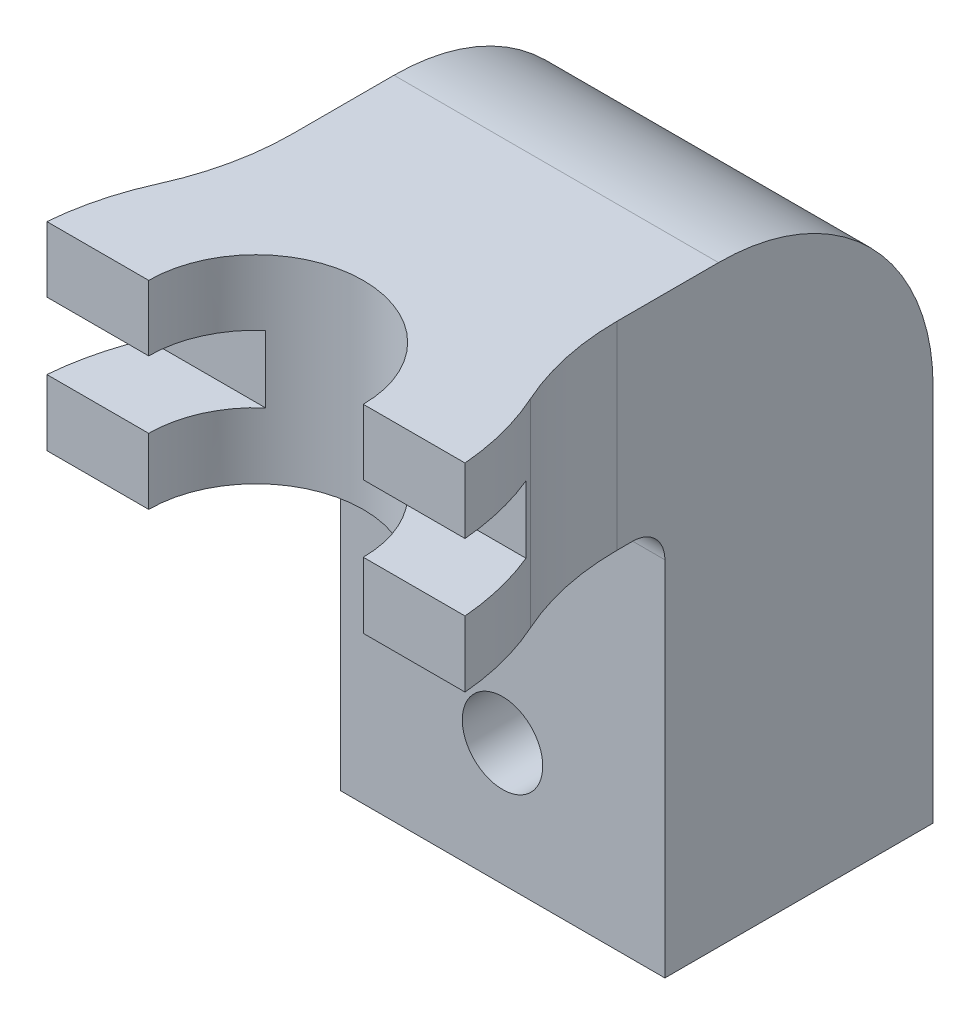
ISO-10303-21;
HEADER;
FILE_DESCRIPTION(('STEP AP214'),'2;1');
FILE_NAME('part.step','',(''),(''),'','','');
FILE_SCHEMA(('AUTOMOTIVE_DESIGN { 1 0 10303 214 1 1 1 1 }'));
ENDSEC;
DATA;
#1=APPLICATION_CONTEXT('core data for automotive mechanical design processes');
#2=APPLICATION_PROTOCOL_DEFINITION('international standard','automotive_design',2000,#1);
#3=PRODUCT_CONTEXT('',#1,'mechanical');
#4=PRODUCT('Part','Part','',(#3));
#5=PRODUCT_RELATED_PRODUCT_CATEGORY('part','',(#4));
#6=PRODUCT_DEFINITION_FORMATION('','',#4);
#7=PRODUCT_DEFINITION_CONTEXT('part definition',#1,'design');
#8=PRODUCT_DEFINITION('design','',#6,#7);
#9=PRODUCT_DEFINITION_SHAPE('','',#8);
#10=(LENGTH_UNIT() NAMED_UNIT(*) SI_UNIT(.MILLI.,.METRE.));
#11=(NAMED_UNIT(*) PLANE_ANGLE_UNIT() SI_UNIT($,.RADIAN.));
#12=(NAMED_UNIT(*) SI_UNIT($,.STERADIAN.) SOLID_ANGLE_UNIT());
#13=UNCERTAINTY_MEASURE_WITH_UNIT(LENGTH_MEASURE(1.E-05),#10,'distance_accuracy_value','');
#14=(GEOMETRIC_REPRESENTATION_CONTEXT(3) GLOBAL_UNCERTAINTY_ASSIGNED_CONTEXT((#13)) GLOBAL_UNIT_ASSIGNED_CONTEXT((#10,
#11,#12)) REPRESENTATION_CONTEXT('',''));
#15=CARTESIAN_POINT('',(0.,0.,0.));
#16=DIRECTION('',(0.,0.,1.));
#17=DIRECTION('',(1.,0.,0.));
#18=AXIS2_PLACEMENT_3D('',#15,#16,#17);
#19=CARTESIAN_POINT('',(6.05,11.05,19.1965710588231));
#20=DIRECTION('',(0.,0.,1.));
#21=DIRECTION('',(1.,0.,0.));
#22=AXIS2_PLACEMENT_3D('',#19,#20,#21);
#23=PLANE('',#22);
#24=DIRECTION('',(1.,0.,0.));
#25=VECTOR('',#24,1.);
#26=CARTESIAN_POINT('',(0.,8.61100015902011,19.1965710588231));
#27=LINE('',#26,#25);
#28=CARTESIAN_POINT('',(4.,8.61100015902011,19.1965710588231));
#29=VERTEX_POINT('',#28);
#30=CARTESIAN_POINT('',(7.79487874350443,8.61100015902011,19.1965710588231));
#31=VERTEX_POINT('',#30);
#32=EDGE_CURVE('E271',#29,#31,#27,.T.);
#33=ORIENTED_EDGE('',*,*,#32,.T.);
#34=DIRECTION('',(0.,1.,0.));
#35=VECTOR('',#34,1.);
#36=CARTESIAN_POINT('',(7.79487874350442,-1.39612428507829,19.1965710588231));
#37=LINE('',#36,#35);
#38=CARTESIAN_POINT('',(7.79487874350443,11.05,19.1965710588231));
#39=VERTEX_POINT('',#38);
#40=EDGE_CURVE('E444',#31,#39,#37,.T.);
#41=ORIENTED_EDGE('',*,*,#40,.T.);
#42=DIRECTION('',(-1.,0.,0.));
#43=VECTOR('',#42,1.);
#44=CARTESIAN_POINT('',(6.05,11.05,19.1965710588231));
#45=LINE('',#44,#43);
#46=CARTESIAN_POINT('',(4.,11.05,19.1965710588231));
#47=VERTEX_POINT('',#46);
#48=EDGE_CURVE('E290',#39,#47,#45,.T.);
#49=ORIENTED_EDGE('',*,*,#48,.T.);
#50=DIRECTION('',(0.,1.,0.));
#51=VECTOR('',#50,1.);
#52=CARTESIAN_POINT('',(4.,1.05,19.1965710588231));
#53=LINE('',#52,#51);
#54=EDGE_CURVE('E267',#29,#47,#53,.T.);
#55=ORIENTED_EDGE('',*,*,#54,.F.);
#56=EDGE_LOOP('',(#33,#41,#49,#55));
#57=FACE_BOUND('',#56,.T.);
#58=ADVANCED_FACE('F41',(#57),#23,.T.);
#59=CARTESIAN_POINT('',(7.79487874350443,3.65326576757497,19.1965710588231));
#60=VERTEX_POINT('',#59);
#61=CARTESIAN_POINT('',(7.79487874350442,6.11100015902011,19.1965710588231));
#62=VERTEX_POINT('',#61);
#63=EDGE_CURVE('E248',#60,#62,#37,.T.);
#64=ORIENTED_EDGE('',*,*,#63,.T.);
#65=DIRECTION('',(-1.,0.,0.));
#66=VECTOR('',#65,1.);
#67=CARTESIAN_POINT('',(0.,6.11100015902011,19.1965710588231));
#68=LINE('',#67,#66);
#69=CARTESIAN_POINT('',(4.,6.11100015902011,19.1965710588231));
#70=VERTEX_POINT('',#69);
#71=EDGE_CURVE('E235',#62,#70,#68,.T.);
#72=ORIENTED_EDGE('',*,*,#71,.T.);
#73=DIRECTION('',(0.,1.,0.));
#74=VECTOR('',#73,1.);
#75=CARTESIAN_POINT('',(4.,1.05,19.1965710588231));
#76=LINE('',#75,#74);
#77=CARTESIAN_POINT('',(4.,3.65326576757497,19.1965710588231));
#78=VERTEX_POINT('',#77);
#79=EDGE_CURVE('E260',#78,#70,#76,.T.);
#80=ORIENTED_EDGE('',*,*,#79,.F.);
#81=DIRECTION('',(-1.,0.,0.));
#82=VECTOR('',#81,1.);
#83=CARTESIAN_POINT('',(6.05,3.65326576757497,19.1965710588231));
#84=LINE('',#83,#82);
#85=EDGE_CURVE('E295',#60,#78,#84,.T.);
#86=ORIENTED_EDGE('',*,*,#85,.F.);
#87=EDGE_LOOP('',(#64,#72,#80,#86));
#88=FACE_BOUND('',#87,.T.);
#89=ADVANCED_FACE('F509',(#88),#23,.T.);
#90=DIRECTION('',(0.,1.,0.));
#91=VECTOR('',#90,1.);
#92=CARTESIAN_POINT('',(-7.79487874350442,-1.39612428507828,19.1965710588231));
#93=LINE('',#92,#91);
#94=CARTESIAN_POINT('',(-7.79487874350442,8.61100015902011,19.1965710588231));
#95=VERTEX_POINT('',#94);
#96=CARTESIAN_POINT('',(-7.79487874350442,11.05,19.1965710588231));
#97=VERTEX_POINT('',#96);
#98=EDGE_CURVE('E243',#95,#97,#93,.T.);
#99=ORIENTED_EDGE('',*,*,#98,.F.);
#100=DIRECTION('',(1.,0.,0.));
#101=VECTOR('',#100,1.);
#102=CARTESIAN_POINT('',(0.,8.61100015902011,19.1965710588231));
#103=LINE('',#102,#101);
#104=CARTESIAN_POINT('',(-4.,8.61100015902011,19.1965710588231));
#105=VERTEX_POINT('',#104);
#106=EDGE_CURVE('E236',#95,#105,#103,.T.);
#107=ORIENTED_EDGE('',*,*,#106,.T.);
#108=DIRECTION('',(0.,1.,0.));
#109=VECTOR('',#108,1.);
#110=CARTESIAN_POINT('',(-4.,1.05,19.1965710588231));
#111=LINE('',#110,#109);
#112=CARTESIAN_POINT('',(-3.99999999999999,11.05,19.1965710588231));
#113=VERTEX_POINT('',#112);
#114=EDGE_CURVE('E255',#113,#105,#111,.F.);
#115=ORIENTED_EDGE('',*,*,#114,.F.);
#116=EDGE_CURVE('E294',#113,#97,#45,.T.);
#117=ORIENTED_EDGE('',*,*,#116,.T.);
#118=EDGE_LOOP('',(#99,#107,#115,#117));
#119=FACE_BOUND('',#118,.T.);
#120=ADVANCED_FACE('F463',(#119),#23,.T.);
#121=DIRECTION('',(-1.,0.,0.));
#122=VECTOR('',#121,1.);
#123=CARTESIAN_POINT('',(0.,6.11100015902011,19.1965710588231));
#124=LINE('',#123,#122);
#125=CARTESIAN_POINT('',(-4.,6.11100015902011,19.1965710588231));
#126=VERTEX_POINT('',#125);
#127=CARTESIAN_POINT('',(-7.79487874350442,6.11100015902011,19.1965710588231));
#128=VERTEX_POINT('',#127);
#129=EDGE_CURVE('E218',#126,#128,#124,.T.);
#130=ORIENTED_EDGE('',*,*,#129,.T.);
#131=CARTESIAN_POINT('',(-7.79487874350442,3.65326576757497,19.1965710588231));
#132=VERTEX_POINT('',#131);
#133=EDGE_CURVE('E232',#132,#128,#93,.T.);
#134=ORIENTED_EDGE('',*,*,#133,.F.);
#135=CARTESIAN_POINT('',(-4.,3.65326576757497,19.1965710588231));
#136=VERTEX_POINT('',#135);
#137=EDGE_CURVE('E287',#136,#132,#84,.T.);
#138=ORIENTED_EDGE('',*,*,#137,.F.);
#139=DIRECTION('',(0.,1.,0.));
#140=VECTOR('',#139,1.);
#141=CARTESIAN_POINT('',(-4.,1.05,19.1965710588231));
#142=LINE('',#141,#140);
#143=EDGE_CURVE('E234',#126,#136,#142,.F.);
#144=ORIENTED_EDGE('',*,*,#143,.F.);
#145=EDGE_LOOP('',(#130,#134,#138,#144));
#146=FACE_BOUND('',#145,.T.);
#147=ADVANCED_FACE('F230',(#146),#23,.T.);
#148=CARTESIAN_POINT('',(6.05,-11.05,10.));
#149=DIRECTION('',(-1.,0.,0.));
#150=DIRECTION('',(0.,0.,1.));
#151=AXIS2_PLACEMENT_3D('',#148,#149,#150);
#152=PLANE('',#151);
#153=DIRECTION('',(0.,0.,-1.));
#154=VECTOR('',#153,1.);
#155=CARTESIAN_POINT('',(6.05,11.05,10.));
#156=LINE('',#155,#154);
#157=CARTESIAN_POINT('',(6.05,11.05,11.7777934970437));
#158=VERTEX_POINT('',#157);
#159=CARTESIAN_POINT('',(6.05,11.05,8.));
#160=VERTEX_POINT('',#159);
#161=EDGE_CURVE('E365',#158,#160,#156,.T.);
#162=ORIENTED_EDGE('',*,*,#161,.F.);
#163=DIRECTION('',(0.,1.,0.));
#164=VECTOR('',#163,1.);
#165=CARTESIAN_POINT('',(6.05,-11.05,11.7777934970437));
#166=LINE('',#165,#164);
#167=CARTESIAN_POINT('',(6.05,3.65326576757497,11.7777934970437));
#168=VERTEX_POINT('',#167);
#169=EDGE_CURVE('E400',#158,#168,#166,.F.);
#170=ORIENTED_EDGE('',*,*,#169,.T.);
#171=DIRECTION('',(0.,0.,1.));
#172=VECTOR('',#171,1.);
#173=CARTESIAN_POINT('',(6.05,3.65326576757497,19.1965710588231));
#174=LINE('',#173,#172);
#175=CARTESIAN_POINT('',(6.05,3.65326576757497,11.2));
#176=VERTEX_POINT('',#175);
#177=EDGE_CURVE('E284',#176,#168,#174,.T.);
#178=ORIENTED_EDGE('',*,*,#177,.F.);
#179=CARTESIAN_POINT('',(6.05,2.45326576757497,11.2));
#180=DIRECTION('',(-1.,0.,0.));
#181=DIRECTION('',(0.,0.,1.));
#182=AXIS2_PLACEMENT_3D('',#179,#180,#181);
#183=CIRCLE('',#182,1.2);
#184=CARTESIAN_POINT('',(6.05,2.45326576757496,10.));
#185=VERTEX_POINT('',#184);
#186=EDGE_CURVE('E384',#176,#185,#183,.T.);
#187=ORIENTED_EDGE('',*,*,#186,.T.);
#188=DIRECTION('',(0.,1.,0.));
#189=VECTOR('',#188,1.);
#190=CARTESIAN_POINT('',(6.05,-11.05,10.));
#191=LINE('',#190,#189);
#192=CARTESIAN_POINT('',(6.05,-11.05,10.));
#193=VERTEX_POINT('',#192);
#194=EDGE_CURVE('E355',#193,#185,#191,.T.);
#195=ORIENTED_EDGE('',*,*,#194,.F.);
#196=DIRECTION('',(0.,0.,-1.));
#197=VECTOR('',#196,1.);
#198=CARTESIAN_POINT('',(6.05,-11.05,10.));
#199=LINE('',#198,#197);
#200=CARTESIAN_POINT('',(6.05,-11.05,0.));
#201=VERTEX_POINT('',#200);
#202=EDGE_CURVE('E367',#193,#201,#199,.T.);
#203=ORIENTED_EDGE('',*,*,#202,.T.);
#204=DIRECTION('',(0.,1.,0.));
#205=VECTOR('',#204,1.);
#206=CARTESIAN_POINT('',(6.05,-11.05,0.));
#207=LINE('',#206,#205);
#208=CARTESIAN_POINT('',(6.05,3.05,0.));
#209=VERTEX_POINT('',#208);
#210=EDGE_CURVE('E353',#201,#209,#207,.T.);
#211=ORIENTED_EDGE('',*,*,#210,.T.);
#212=CARTESIAN_POINT('',(6.05,3.05,8.));
#213=DIRECTION('',(-1.,0.,0.));
#214=DIRECTION('',(0.,0.,1.));
#215=AXIS2_PLACEMENT_3D('',#212,#213,#214);
#216=CIRCLE('',#215,8.);
#217=EDGE_CURVE('E393',#209,#160,#216,.F.);
#218=ORIENTED_EDGE('',*,*,#217,.T.);
#219=EDGE_LOOP('',(#162,#170,#178,#187,#195,#203,#211,#218));
#220=FACE_BOUND('',#219,.T.);
#221=ADVANCED_FACE('F490',(#220),#152,.F.);
#222=CARTESIAN_POINT('',(0.,0.,16.1965710588231));
#223=DIRECTION('',(0.,0.,1.));
#224=DIRECTION('',(1.,0.,0.));
#225=AXIS2_PLACEMENT_3D('',#222,#223,#224);
#226=PLANE('',#225);
#227=DIRECTION('',(-1.,0.,0.));
#228=VECTOR('',#227,1.);
#229=CARTESIAN_POINT('',(0.,6.11100015902011,16.1965710588231));
#230=LINE('',#229,#228);
#231=CARTESIAN_POINT('',(7.06768371328253,6.11100015902011,16.1965710588231));
#232=VERTEX_POINT('',#231);
#233=CARTESIAN_POINT('',(2.64575131106459,6.11100015902011,16.1965710588231));
#234=VERTEX_POINT('',#233);
#235=EDGE_CURVE('E273',#232,#234,#230,.T.);
#236=ORIENTED_EDGE('',*,*,#235,.F.);
#237=DIRECTION('',(0.,1.,0.));
#238=VECTOR('',#237,1.);
#239=CARTESIAN_POINT('',(7.06768371328253,6.11100015902011,16.1965710588231));
#240=LINE('',#239,#238);
#241=CARTESIAN_POINT('',(7.06768371328253,8.61100015902011,16.1965710588231));
#242=VERTEX_POINT('',#241);
#243=EDGE_CURVE('E49',#232,#242,#240,.T.);
#244=ORIENTED_EDGE('',*,*,#243,.T.);
#245=DIRECTION('',(1.,0.,0.));
#246=VECTOR('',#245,1.);
#247=CARTESIAN_POINT('',(0.,8.61100015902011,16.1965710588231));
#248=LINE('',#247,#246);
#249=CARTESIAN_POINT('',(2.64575131106459,8.61100015902011,16.1965710588231));
#250=VERTEX_POINT('',#249);
#251=EDGE_CURVE('E275',#250,#242,#248,.T.);
#252=ORIENTED_EDGE('',*,*,#251,.F.);
#253=DIRECTION('',(0.,1.,0.));
#254=VECTOR('',#253,1.);
#255=CARTESIAN_POINT('',(2.64575131106459,1.05,16.1965710588231));
#256=LINE('',#255,#254);
#257=EDGE_CURVE('E398',#234,#250,#256,.T.);
#258=ORIENTED_EDGE('',*,*,#257,.F.);
#259=EDGE_LOOP('',(#236,#244,#252,#258));
#260=FACE_BOUND('',#259,.T.);
#261=ADVANCED_FACE('F513',(#260),#226,.T.);
#262=CARTESIAN_POINT('',(-6.05,-11.05,10.));
#263=DIRECTION('',(1.,0.,0.));
#264=DIRECTION('',(0.,0.,-1.));
#265=AXIS2_PLACEMENT_3D('',#262,#263,#264);
#266=PLANE('',#265);
#267=DIRECTION('',(0.,0.,1.));
#268=VECTOR('',#267,1.);
#269=CARTESIAN_POINT('',(-6.05,3.65326576757497,19.1965710588231));
#270=LINE('',#269,#268);
#271=CARTESIAN_POINT('',(-6.05,3.65326576757497,11.2));
#272=VERTEX_POINT('',#271);
#273=CARTESIAN_POINT('',(-6.05,3.65326576757497,11.7777934970437));
#274=VERTEX_POINT('',#273);
#275=EDGE_CURVE('E277',#272,#274,#270,.T.);
#276=ORIENTED_EDGE('',*,*,#275,.T.);
#277=DIRECTION('',(0.,1.,0.));
#278=VECTOR('',#277,1.);
#279=CARTESIAN_POINT('',(-6.05,11.05,11.7777934970437));
#280=LINE('',#279,#278);
#281=CARTESIAN_POINT('',(-6.05,11.05,11.7777934970437));
#282=VERTEX_POINT('',#281);
#283=EDGE_CURVE('E402',#274,#282,#280,.T.);
#284=ORIENTED_EDGE('',*,*,#283,.T.);
#285=DIRECTION('',(0.,0.,-1.));
#286=VECTOR('',#285,1.);
#287=CARTESIAN_POINT('',(-6.05,11.05,10.));
#288=LINE('',#287,#286);
#289=CARTESIAN_POINT('',(-6.05,11.05,8.));
#290=VERTEX_POINT('',#289);
#291=EDGE_CURVE('E358',#282,#290,#288,.T.);
#292=ORIENTED_EDGE('',*,*,#291,.T.);
#293=CARTESIAN_POINT('',(-6.05,3.05,8.));
#294=DIRECTION('',(1.,0.,0.));
#295=DIRECTION('',(0.,0.,-1.));
#296=AXIS2_PLACEMENT_3D('',#293,#294,#295);
#297=CIRCLE('',#296,8.);
#298=CARTESIAN_POINT('',(-6.05,3.05,0.));
#299=VERTEX_POINT('',#298);
#300=EDGE_CURVE('E389',#290,#299,#297,.F.);
#301=ORIENTED_EDGE('',*,*,#300,.T.);
#302=DIRECTION('',(0.,-1.,0.));
#303=VECTOR('',#302,1.);
#304=CARTESIAN_POINT('',(-6.05,-11.05,0.));
#305=LINE('',#304,#303);
#306=CARTESIAN_POINT('',(-6.05,-11.05,0.));
#307=VERTEX_POINT('',#306);
#308=EDGE_CURVE('E343',#299,#307,#305,.T.);
#309=ORIENTED_EDGE('',*,*,#308,.T.);
#310=DIRECTION('',(0.,0.,-1.));
#311=VECTOR('',#310,1.);
#312=CARTESIAN_POINT('',(-6.05,-11.05,10.));
#313=LINE('',#312,#311);
#314=CARTESIAN_POINT('',(-6.05,-11.05,10.));
#315=VERTEX_POINT('',#314);
#316=EDGE_CURVE('E370',#315,#307,#313,.T.);
#317=ORIENTED_EDGE('',*,*,#316,.F.);
#318=DIRECTION('',(0.,-1.,0.));
#319=VECTOR('',#318,1.);
#320=CARTESIAN_POINT('',(-6.05,-11.05,10.));
#321=LINE('',#320,#319);
#322=CARTESIAN_POINT('',(-6.05,2.45326576757496,10.));
#323=VERTEX_POINT('',#322);
#324=EDGE_CURVE('E350',#323,#315,#321,.T.);
#325=ORIENTED_EDGE('',*,*,#324,.F.);
#326=CARTESIAN_POINT('',(-6.05,2.45326576757497,11.2));
#327=DIRECTION('',(1.,0.,0.));
#328=DIRECTION('',(0.,0.,-1.));
#329=AXIS2_PLACEMENT_3D('',#326,#327,#328);
#330=CIRCLE('',#329,1.2);
#331=EDGE_CURVE('E382',#323,#272,#330,.T.);
#332=ORIENTED_EDGE('',*,*,#331,.T.);
#333=EDGE_LOOP('',(#276,#284,#292,#301,#309,#317,#325,#332));
#334=FACE_BOUND('',#333,.T.);
#335=ADVANCED_FACE('F478',(#334),#266,.F.);
#336=CARTESIAN_POINT('',(-6.05,-11.05,10.));
#337=DIRECTION('',(0.,1.,0.));
#338=DIRECTION('',(0.,0.,1.));
#339=AXIS2_PLACEMENT_3D('',#336,#337,#338);
#340=PLANE('',#339);
#341=DIRECTION('',(-1.,0.,0.));
#342=VECTOR('',#341,1.);
#343=CARTESIAN_POINT('',(-4.125,-11.05,7.625));
#344=LINE('',#343,#342);
#345=CARTESIAN_POINT('',(4.125,-11.05,7.625));
#346=VERTEX_POINT('',#345);
#347=CARTESIAN_POINT('',(-4.125,-11.05,7.625));
#348=VERTEX_POINT('',#347);
#349=EDGE_CURVE('E333',#346,#348,#344,.T.);
#350=ORIENTED_EDGE('',*,*,#349,.F.);
#351=DIRECTION('',(0.,0.,1.));
#352=VECTOR('',#351,1.);
#353=CARTESIAN_POINT('',(4.125,-11.05,2.375));
#354=LINE('',#353,#352);
#355=CARTESIAN_POINT('',(4.125,-11.05,2.375));
#356=VERTEX_POINT('',#355);
#357=EDGE_CURVE('E317',#356,#346,#354,.T.);
#358=ORIENTED_EDGE('',*,*,#357,.F.);
#359=DIRECTION('',(1.,0.,0.));
#360=VECTOR('',#359,1.);
#361=CARTESIAN_POINT('',(-4.125,-11.05,2.375));
#362=LINE('',#361,#360);
#363=CARTESIAN_POINT('',(-4.125,-11.05,2.375));
#364=VERTEX_POINT('',#363);
#365=EDGE_CURVE('E322',#364,#356,#362,.T.);
#366=ORIENTED_EDGE('',*,*,#365,.F.);
#367=DIRECTION('',(0.,0.,-1.));
#368=VECTOR('',#367,1.);
#369=CARTESIAN_POINT('',(-4.125,-11.05,2.375));
#370=LINE('',#369,#368);
#371=EDGE_CURVE('E336',#348,#364,#370,.T.);
#372=ORIENTED_EDGE('',*,*,#371,.F.);
#373=EDGE_LOOP('',(#350,#358,#366,#372));
#374=FACE_BOUND('',#373,.T.);
#375=DIRECTION('',(1.,0.,0.));
#376=VECTOR('',#375,1.);
#377=CARTESIAN_POINT('',(-6.05,-11.05,0.));
#378=LINE('',#377,#376);
#379=EDGE_CURVE('E360',#307,#201,#378,.T.);
#380=ORIENTED_EDGE('',*,*,#379,.T.);
#381=ORIENTED_EDGE('',*,*,#202,.F.);
#382=DIRECTION('',(1.,0.,0.));
#383=VECTOR('',#382,1.);
#384=CARTESIAN_POINT('',(-6.05,-11.05,10.));
#385=LINE('',#384,#383);
#386=EDGE_CURVE('E352',#315,#193,#385,.T.);
#387=ORIENTED_EDGE('',*,*,#386,.F.);
#388=ORIENTED_EDGE('',*,*,#316,.T.);
#389=EDGE_LOOP('',(#380,#381,#387,#388));
#390=FACE_BOUND('',#389,.T.);
#391=ADVANCED_FACE('F495',(#374,#390),#340,.F.);
#392=CARTESIAN_POINT('',(-6.05,11.05,10.));
#393=DIRECTION('',(0.,-1.,0.));
#394=DIRECTION('',(1.,0.,0.));
#395=AXIS2_PLACEMENT_3D('',#392,#393,#394);
#396=PLANE('',#395);
#397=CARTESIAN_POINT('',(-16.05,11.05,11.7777934970437));
#398=DIRECTION('',(0.,-1.,0.));
#399=DIRECTION('',(1.,0.,0.));
#400=AXIS2_PLACEMENT_3D('',#397,#398,#399);
#401=CIRCLE('',#400,10.);
#402=CARTESIAN_POINT('',(-6.9395890907623,11.05,15.900949213827));
#403=VERTEX_POINT('',#402);
#404=EDGE_CURVE('E410',#282,#403,#401,.T.);
#405=ORIENTED_EDGE('',*,*,#404,.T.);
#406=CARTESIAN_POINT('',(2.1708218184754,11.05,20.0241049306103));
#407=DIRECTION('',(0.,-1.,0.));
#408=DIRECTION('',(1.,0.,0.));
#409=AXIS2_PLACEMENT_3D('',#406,#407,#408);
#410=CIRCLE('',#409,10.);
#411=EDGE_CURVE('E420',#403,#97,#410,.F.);
#412=ORIENTED_EDGE('',*,*,#411,.T.);
#413=ORIENTED_EDGE('',*,*,#116,.F.);
#414=CARTESIAN_POINT('',(0.,11.05,19.1965710588231));
#415=DIRECTION('',(0.,1.,0.));
#416=DIRECTION('',(-1.,0.,0.));
#417=AXIS2_PLACEMENT_3D('',#414,#415,#416);
#418=CIRCLE('',#417,4.);
#419=EDGE_CURVE('E242',#47,#113,#418,.T.);
#420=ORIENTED_EDGE('',*,*,#419,.F.);
#421=ORIENTED_EDGE('',*,*,#48,.F.);
#422=CARTESIAN_POINT('',(-2.17082181847539,11.05,20.0241049306103));
#423=DIRECTION('',(0.,-1.,0.));
#424=DIRECTION('',(1.,0.,0.));
#425=AXIS2_PLACEMENT_3D('',#422,#423,#424);
#426=CIRCLE('',#425,10.);
#427=CARTESIAN_POINT('',(6.9395890907623,11.05,15.900949213827));
#428=VERTEX_POINT('',#427);
#429=EDGE_CURVE('E418',#39,#428,#426,.F.);
#430=ORIENTED_EDGE('',*,*,#429,.T.);
#431=CARTESIAN_POINT('',(16.05,11.05,11.7777934970437));
#432=DIRECTION('',(0.,-1.,0.));
#433=DIRECTION('',(1.,0.,0.));
#434=AXIS2_PLACEMENT_3D('',#431,#432,#433);
#435=CIRCLE('',#434,10.);
#436=EDGE_CURVE('E405',#428,#158,#435,.T.);
#437=ORIENTED_EDGE('',*,*,#436,.T.);
#438=ORIENTED_EDGE('',*,*,#161,.T.);
#439=DIRECTION('',(-1.,0.,0.));
#440=VECTOR('',#439,1.);
#441=CARTESIAN_POINT('',(-6.05,11.05,8.));
#442=LINE('',#441,#440);
#443=EDGE_CURVE('E386',#160,#290,#442,.T.);
#444=ORIENTED_EDGE('',*,*,#443,.T.);
#445=ORIENTED_EDGE('',*,*,#291,.F.);
#446=EDGE_LOOP('',(#405,#412,#413,#420,#421,#430,#437,#438,#444,#445));
#447=FACE_BOUND('',#446,.T.);
#448=ADVANCED_FACE('F454',(#447),#396,.F.);
#449=CARTESIAN_POINT('',(0.,0.,10.));
#450=DIRECTION('',(0.,0.,-1.));
#451=DIRECTION('',(-1.,0.,0.));
#452=AXIS2_PLACEMENT_3D('',#449,#450,#451);
#453=PLANE('',#452);
#454=CARTESIAN_POINT('',(-0.00434846800764083,0.010473297800019,10.));
#455=DIRECTION('',(0.,0.,-1.));
#456=DIRECTION('',(-1.,0.,0.));
#457=AXIS2_PLACEMENT_3D('',#454,#455,#456);
#458=CIRCLE('',#457,1.5);
#459=CARTESIAN_POINT('',(-1.50434846800764,0.010473297800019,10.));
#460=VERTEX_POINT('',#459);
#461=EDGE_CURVE('E298',#460,#460,#458,.T.);
#462=ORIENTED_EDGE('',*,*,#461,.T.);
#463=EDGE_LOOP('',(#462));
#464=FACE_BOUND('',#463,.T.);
#465=CARTESIAN_POINT('',(-0.00434846800764083,-6.48952670219998,10.));
#466=DIRECTION('',(0.,0.,-1.));
#467=DIRECTION('',(-1.,0.,0.));
#468=AXIS2_PLACEMENT_3D('',#465,#466,#467);
#469=CIRCLE('',#468,1.5);
#470=CARTESIAN_POINT('',(-1.50434846800764,-6.48952670219998,10.));
#471=VERTEX_POINT('',#470);
#472=EDGE_CURVE('E308',#471,#471,#469,.T.);
#473=ORIENTED_EDGE('',*,*,#472,.T.);
#474=EDGE_LOOP('',(#473));
#475=FACE_BOUND('',#474,.T.);
#476=ORIENTED_EDGE('',*,*,#194,.T.);
#477=DIRECTION('',(-1.,0.,0.));
#478=VECTOR('',#477,1.);
#479=CARTESIAN_POINT('',(0.,2.45326576757497,10.));
#480=LINE('',#479,#478);
#481=EDGE_CURVE('E373',#185,#323,#480,.T.);
#482=ORIENTED_EDGE('',*,*,#481,.T.);
#483=ORIENTED_EDGE('',*,*,#324,.T.);
#484=ORIENTED_EDGE('',*,*,#386,.T.);
#485=EDGE_LOOP('',(#476,#482,#483,#484));
#486=FACE_BOUND('',#485,.T.);
#487=ADVANCED_FACE('F500',(#464,#475,#486),#453,.F.);
#488=CARTESIAN_POINT('',(0.,0.,0.));
#489=DIRECTION('',(0.,0.,-1.));
#490=DIRECTION('',(-1.,0.,0.));
#491=AXIS2_PLACEMENT_3D('',#488,#489,#490);
#492=PLANE('',#491);
#493=CARTESIAN_POINT('',(-0.00434846800764083,0.010473297800019,0.));
#494=DIRECTION('',(0.,0.,-1.));
#495=DIRECTION('',(-1.,0.,0.));
#496=AXIS2_PLACEMENT_3D('',#493,#494,#495);
#497=CIRCLE('',#496,1.5);
#498=CARTESIAN_POINT('',(-1.50434846800764,0.010473297800019,0.));
#499=VERTEX_POINT('',#498);
#500=EDGE_CURVE('E293',#499,#499,#497,.T.);
#501=ORIENTED_EDGE('',*,*,#500,.F.);
#502=EDGE_LOOP('',(#501));
#503=FACE_BOUND('',#502,.T.);
#504=CARTESIAN_POINT('',(-0.00434846800764083,-6.48952670219998,0.));
#505=DIRECTION('',(0.,0.,-1.));
#506=DIRECTION('',(-1.,0.,0.));
#507=AXIS2_PLACEMENT_3D('',#504,#505,#506);
#508=CIRCLE('',#507,1.5);
#509=CARTESIAN_POINT('',(-1.50434846800764,-6.48952670219998,0.));
#510=VERTEX_POINT('',#509);
#511=EDGE_CURVE('E307',#510,#510,#508,.T.);
#512=ORIENTED_EDGE('',*,*,#511,.F.);
#513=EDGE_LOOP('',(#512));
#514=FACE_BOUND('',#513,.T.);
#515=ORIENTED_EDGE('',*,*,#308,.F.);
#516=DIRECTION('',(-1.,0.,0.));
#517=VECTOR('',#516,1.);
#518=CARTESIAN_POINT('',(6.05,3.05,0.));
#519=LINE('',#518,#517);
#520=EDGE_CURVE('E391',#299,#209,#519,.F.);
#521=ORIENTED_EDGE('',*,*,#520,.T.);
#522=ORIENTED_EDGE('',*,*,#210,.F.);
#523=ORIENTED_EDGE('',*,*,#379,.F.);
#524=EDGE_LOOP('',(#515,#521,#522,#523));
#525=FACE_BOUND('',#524,.T.);
#526=ADVANCED_FACE('F486',(#503,#514,#525),#492,.T.);
#527=CARTESIAN_POINT('',(4.125,6.95,2.375));
#528=DIRECTION('',(1.,0.,0.));
#529=DIRECTION('',(0.,0.,-1.));
#530=AXIS2_PLACEMENT_3D('',#527,#528,#529);
#531=PLANE('',#530);
#532=ORIENTED_EDGE('',*,*,#357,.T.);
#533=DIRECTION('',(0.,-1.,0.));
#534=VECTOR('',#533,1.);
#535=CARTESIAN_POINT('',(4.125,6.95,7.625));
#536=LINE('',#535,#534);
#537=CARTESIAN_POINT('',(4.125,6.95,7.625));
#538=VERTEX_POINT('',#537);
#539=EDGE_CURVE('E331',#538,#346,#536,.T.);
#540=ORIENTED_EDGE('',*,*,#539,.F.);
#541=DIRECTION('',(0.,0.,1.));
#542=VECTOR('',#541,1.);
#543=CARTESIAN_POINT('',(4.125,6.95,2.375));
#544=LINE('',#543,#542);
#545=CARTESIAN_POINT('',(4.125,6.95,2.375));
#546=VERTEX_POINT('',#545);
#547=EDGE_CURVE('E318',#546,#538,#544,.T.);
#548=ORIENTED_EDGE('',*,*,#547,.F.);
#549=DIRECTION('',(0.,-1.,0.));
#550=VECTOR('',#549,1.);
#551=CARTESIAN_POINT('',(4.125,6.95,2.375));
#552=LINE('',#551,#550);
#553=EDGE_CURVE('E341',#546,#356,#552,.T.);
#554=ORIENTED_EDGE('',*,*,#553,.T.);
#555=EDGE_LOOP('',(#532,#540,#548,#554));
#556=FACE_BOUND('',#555,.T.);
#557=ADVANCED_FACE('F596',(#556),#531,.F.);
#558=CARTESIAN_POINT('',(-4.125,6.95,2.375));
#559=DIRECTION('',(0.,0.,-1.));
#560=DIRECTION('',(-1.,0.,0.));
#561=AXIS2_PLACEMENT_3D('',#558,#559,#560);
#562=PLANE('',#561);
#563=CARTESIAN_POINT('',(-0.00434846800764083,0.010473297800019,2.375));
#564=DIRECTION('',(0.,0.,-1.));
#565=DIRECTION('',(-1.,0.,0.));
#566=AXIS2_PLACEMENT_3D('',#563,#564,#565);
#567=CIRCLE('',#566,1.5);
#568=CARTESIAN_POINT('',(-1.50434846800764,0.010473297800019,2.375));
#569=VERTEX_POINT('',#568);
#570=EDGE_CURVE('E304',#569,#569,#567,.T.);
#571=ORIENTED_EDGE('',*,*,#570,.T.);
#572=EDGE_LOOP('',(#571));
#573=FACE_BOUND('',#572,.T.);
#574=CARTESIAN_POINT('',(-0.00434846800764083,-6.48952670219998,2.375));
#575=DIRECTION('',(0.,0.,-1.));
#576=DIRECTION('',(-1.,0.,0.));
#577=AXIS2_PLACEMENT_3D('',#574,#575,#576);
#578=CIRCLE('',#577,1.5);
#579=CARTESIAN_POINT('',(-1.50434846800764,-6.48952670219998,2.375));
#580=VERTEX_POINT('',#579);
#581=EDGE_CURVE('E314',#580,#580,#578,.T.);
#582=ORIENTED_EDGE('',*,*,#581,.T.);
#583=EDGE_LOOP('',(#582));
#584=FACE_BOUND('',#583,.T.);
#585=ORIENTED_EDGE('',*,*,#365,.T.);
#586=ORIENTED_EDGE('',*,*,#553,.F.);
#587=DIRECTION('',(1.,0.,0.));
#588=VECTOR('',#587,1.);
#589=CARTESIAN_POINT('',(-4.125,6.95,2.375));
#590=LINE('',#589,#588);
#591=CARTESIAN_POINT('',(-4.125,6.95,2.375));
#592=VERTEX_POINT('',#591);
#593=EDGE_CURVE('E328',#592,#546,#590,.T.);
#594=ORIENTED_EDGE('',*,*,#593,.F.);
#595=DIRECTION('',(0.,-1.,0.));
#596=VECTOR('',#595,1.);
#597=CARTESIAN_POINT('',(-4.125,6.95,2.375));
#598=LINE('',#597,#596);
#599=EDGE_CURVE('E344',#592,#364,#598,.T.);
#600=ORIENTED_EDGE('',*,*,#599,.T.);
#601=EDGE_LOOP('',(#585,#586,#594,#600));
#602=FACE_BOUND('',#601,.T.);
#603=ADVANCED_FACE('F671',(#573,#584,#602),#562,.F.);
#604=CARTESIAN_POINT('',(-4.125,6.95,2.375));
#605=DIRECTION('',(-1.,0.,0.));
#606=DIRECTION('',(0.,0.,1.));
#607=AXIS2_PLACEMENT_3D('',#604,#605,#606);
#608=PLANE('',#607);
#609=ORIENTED_EDGE('',*,*,#371,.T.);
#610=ORIENTED_EDGE('',*,*,#599,.F.);
#611=DIRECTION('',(0.,0.,-1.));
#612=VECTOR('',#611,1.);
#613=CARTESIAN_POINT('',(-4.125,6.95,2.375));
#614=LINE('',#613,#612);
#615=CARTESIAN_POINT('',(-4.125,6.95,7.625));
#616=VERTEX_POINT('',#615);
#617=EDGE_CURVE('E325',#616,#592,#614,.T.);
#618=ORIENTED_EDGE('',*,*,#617,.F.);
#619=DIRECTION('',(0.,-1.,0.));
#620=VECTOR('',#619,1.);
#621=CARTESIAN_POINT('',(-4.125,6.95,7.625));
#622=LINE('',#621,#620);
#623=EDGE_CURVE('E346',#616,#348,#622,.T.);
#624=ORIENTED_EDGE('',*,*,#623,.T.);
#625=EDGE_LOOP('',(#609,#610,#618,#624));
#626=FACE_BOUND('',#625,.T.);
#627=ADVANCED_FACE('F663',(#626),#608,.F.);
#628=CARTESIAN_POINT('',(-4.125,6.95,7.625));
#629=DIRECTION('',(0.,0.,1.));
#630=DIRECTION('',(1.,0.,0.));
#631=AXIS2_PLACEMENT_3D('',#628,#629,#630);
#632=PLANE('',#631);
#633=CARTESIAN_POINT('',(-0.00434846800764083,0.010473297800019,7.625));
#634=DIRECTION('',(0.,0.,1.));
#635=DIRECTION('',(1.,0.,0.));
#636=AXIS2_PLACEMENT_3D('',#633,#634,#635);
#637=CIRCLE('',#636,1.5);
#638=CARTESIAN_POINT('',(1.49565153199236,0.010473297800019,7.625));
#639=VERTEX_POINT('',#638);
#640=EDGE_CURVE('E301',#639,#639,#637,.T.);
#641=ORIENTED_EDGE('',*,*,#640,.T.);
#642=EDGE_LOOP('',(#641));
#643=FACE_BOUND('',#642,.T.);
#644=CARTESIAN_POINT('',(-0.00434846800764083,-6.48952670219998,7.625));
#645=DIRECTION('',(0.,0.,1.));
#646=DIRECTION('',(1.,0.,0.));
#647=AXIS2_PLACEMENT_3D('',#644,#645,#646);
#648=CIRCLE('',#647,1.5);
#649=CARTESIAN_POINT('',(1.49565153199236,-6.48952670219998,7.625));
#650=VERTEX_POINT('',#649);
#651=EDGE_CURVE('E311',#650,#650,#648,.T.);
#652=ORIENTED_EDGE('',*,*,#651,.T.);
#653=EDGE_LOOP('',(#652));
#654=FACE_BOUND('',#653,.T.);
#655=ORIENTED_EDGE('',*,*,#349,.T.);
#656=ORIENTED_EDGE('',*,*,#623,.F.);
#657=DIRECTION('',(-1.,0.,0.));
#658=VECTOR('',#657,1.);
#659=CARTESIAN_POINT('',(-4.125,6.95,7.625));
#660=LINE('',#659,#658);
#661=EDGE_CURVE('E321',#538,#616,#660,.T.);
#662=ORIENTED_EDGE('',*,*,#661,.F.);
#663=ORIENTED_EDGE('',*,*,#539,.T.);
#664=EDGE_LOOP('',(#655,#656,#662,#663));
#665=FACE_BOUND('',#664,.T.);
#666=ADVANCED_FACE('F658',(#643,#654,#665),#632,.F.);
#667=CARTESIAN_POINT('',(0.,6.95,0.));
#668=DIRECTION('',(0.,1.,0.));
#669=DIRECTION('',(0.,0.,1.));
#670=AXIS2_PLACEMENT_3D('',#667,#668,#669);
#671=PLANE('',#670);
#672=ORIENTED_EDGE('',*,*,#547,.T.);
#673=ORIENTED_EDGE('',*,*,#661,.T.);
#674=ORIENTED_EDGE('',*,*,#617,.T.);
#675=ORIENTED_EDGE('',*,*,#593,.T.);
#676=EDGE_LOOP('',(#672,#673,#674,#675));
#677=FACE_BOUND('',#676,.T.);
#678=ADVANCED_FACE('F651',(#677),#671,.F.);
#679=CARTESIAN_POINT('',(-0.00434846800764083,-6.48952670219998,10.));
#680=DIRECTION('',(0.,0.,-1.));
#681=DIRECTION('',(-1.,0.,0.));
#682=AXIS2_PLACEMENT_3D('',#679,#680,#681);
#683=CYLINDRICAL_SURFACE('',#682,1.5);
#684=ORIENTED_EDGE('',*,*,#472,.F.);
#685=EDGE_LOOP('',(#684));
#686=FACE_BOUND('',#685,.T.);
#687=ORIENTED_EDGE('',*,*,#651,.F.);
#688=EDGE_LOOP('',(#687));
#689=FACE_BOUND('',#688,.T.);
#690=ADVANCED_FACE('F641',(#686,#689),#683,.F.);
#691=ORIENTED_EDGE('',*,*,#511,.T.);
#692=EDGE_LOOP('',(#691));
#693=FACE_BOUND('',#692,.T.);
#694=ORIENTED_EDGE('',*,*,#581,.F.);
#695=EDGE_LOOP('',(#694));
#696=FACE_BOUND('',#695,.T.);
#697=ADVANCED_FACE('F632',(#693,#696),#683,.F.);
#698=CARTESIAN_POINT('',(-0.00434846800764083,0.010473297800019,10.));
#699=DIRECTION('',(0.,0.,-1.));
#700=DIRECTION('',(-1.,0.,0.));
#701=AXIS2_PLACEMENT_3D('',#698,#699,#700);
#702=CYLINDRICAL_SURFACE('',#701,1.5);
#703=ORIENTED_EDGE('',*,*,#461,.F.);
#704=EDGE_LOOP('',(#703));
#705=FACE_BOUND('',#704,.T.);
#706=ORIENTED_EDGE('',*,*,#640,.F.);
#707=EDGE_LOOP('',(#706));
#708=FACE_BOUND('',#707,.T.);
#709=ADVANCED_FACE('F621',(#705,#708),#702,.F.);
#710=ORIENTED_EDGE('',*,*,#500,.T.);
#711=EDGE_LOOP('',(#710));
#712=FACE_BOUND('',#711,.T.);
#713=ORIENTED_EDGE('',*,*,#570,.F.);
#714=EDGE_LOOP('',(#713));
#715=FACE_BOUND('',#714,.T.);
#716=ADVANCED_FACE('F523',(#712,#715),#702,.F.);
#717=CARTESIAN_POINT('',(6.05,3.65326576757497,19.1965710588231));
#718=DIRECTION('',(0.,-1.,0.));
#719=DIRECTION('',(0.,0.,-1.));
#720=AXIS2_PLACEMENT_3D('',#717,#718,#719);
#721=PLANE('',#720);
#722=ORIENTED_EDGE('',*,*,#137,.T.);
#723=CARTESIAN_POINT('',(2.1708218184754,3.65326576757497,20.0241049306103));
#724=DIRECTION('',(0.,-1.,0.));
#725=DIRECTION('',(0.,0.,-1.));
#726=AXIS2_PLACEMENT_3D('',#723,#724,#725);
#727=CIRCLE('',#726,10.);
#728=CARTESIAN_POINT('',(-6.9395890907623,3.65326576757497,15.900949213827));
#729=VERTEX_POINT('',#728);
#730=EDGE_CURVE('E241',#132,#729,#727,.T.);
#731=ORIENTED_EDGE('',*,*,#730,.T.);
#732=CARTESIAN_POINT('',(-16.05,3.65326576757497,11.7777934970437));
#733=DIRECTION('',(0.,-1.,0.));
#734=DIRECTION('',(0.,0.,-1.));
#735=AXIS2_PLACEMENT_3D('',#732,#733,#734);
#736=CIRCLE('',#735,10.);
#737=EDGE_CURVE('E413',#729,#274,#736,.F.);
#738=ORIENTED_EDGE('',*,*,#737,.T.);
#739=ORIENTED_EDGE('',*,*,#275,.F.);
#740=DIRECTION('',(-1.,0.,0.));
#741=VECTOR('',#740,1.);
#742=CARTESIAN_POINT('',(6.05,3.65326576757497,11.2));
#743=LINE('',#742,#741);
#744=EDGE_CURVE('E380',#272,#176,#743,.F.);
#745=ORIENTED_EDGE('',*,*,#744,.T.);
#746=ORIENTED_EDGE('',*,*,#177,.T.);
#747=CARTESIAN_POINT('',(16.05,3.65326576757497,11.7777934970437));
#748=DIRECTION('',(0.,-1.,0.));
#749=DIRECTION('',(0.,0.,-1.));
#750=AXIS2_PLACEMENT_3D('',#747,#748,#749);
#751=CIRCLE('',#750,10.);
#752=CARTESIAN_POINT('',(6.9395890907623,3.65326576757497,15.900949213827));
#753=VERTEX_POINT('',#752);
#754=EDGE_CURVE('E407',#168,#753,#751,.F.);
#755=ORIENTED_EDGE('',*,*,#754,.T.);
#756=CARTESIAN_POINT('',(-2.17082181847539,3.65326576757497,20.0241049306103));
#757=DIRECTION('',(0.,-1.,0.));
#758=DIRECTION('',(0.,0.,-1.));
#759=AXIS2_PLACEMENT_3D('',#756,#757,#758);
#760=CIRCLE('',#759,10.);
#761=EDGE_CURVE('E224',#753,#60,#760,.T.);
#762=ORIENTED_EDGE('',*,*,#761,.T.);
#763=ORIENTED_EDGE('',*,*,#85,.T.);
#764=CARTESIAN_POINT('',(0.,3.65326576757497,19.1965710588231));
#765=DIRECTION('',(0.,-1.,0.));
#766=DIRECTION('',(0.,0.,-1.));
#767=AXIS2_PLACEMENT_3D('',#764,#765,#766);
#768=CIRCLE('',#767,4.);
#769=EDGE_CURVE('E258',#136,#78,#768,.T.);
#770=ORIENTED_EDGE('',*,*,#769,.F.);
#771=EDGE_LOOP('',(#722,#731,#738,#739,#745,#746,#755,#762,#763,#770));
#772=FACE_BOUND('',#771,.T.);
#773=ADVANCED_FACE('F438',(#772),#721,.T.);
#774=CARTESIAN_POINT('',(0.,8.61100015902011,16.1965710588231));
#775=DIRECTION('',(0.,-1.,0.));
#776=DIRECTION('',(0.,0.,-1.));
#777=AXIS2_PLACEMENT_3D('',#774,#775,#776);
#778=PLANE('',#777);
#779=ORIENTED_EDGE('',*,*,#251,.T.);
#780=CARTESIAN_POINT('',(-2.17082181847539,8.61100015902011,20.0241049306103));
#781=DIRECTION('',(0.,-1.,0.));
#782=DIRECTION('',(0.,0.,-1.));
#783=AXIS2_PLACEMENT_3D('',#780,#781,#782);
#784=CIRCLE('',#783,10.);
#785=EDGE_CURVE('E11',#242,#31,#784,.T.);
#786=ORIENTED_EDGE('',*,*,#785,.T.);
#787=ORIENTED_EDGE('',*,*,#32,.F.);
#788=CARTESIAN_POINT('',(0.,8.61100015902011,19.1965710588231));
#789=DIRECTION('',(0.,-1.,0.));
#790=DIRECTION('',(0.,0.,-1.));
#791=AXIS2_PLACEMENT_3D('',#788,#789,#790);
#792=CIRCLE('',#791,4.);
#793=EDGE_CURVE('E265',#250,#29,#792,.T.);
#794=ORIENTED_EDGE('',*,*,#793,.F.);
#795=EDGE_LOOP('',(#779,#786,#787,#794));
#796=FACE_BOUND('',#795,.T.);
#797=ADVANCED_FACE('F515',(#796),#778,.T.);
#798=CARTESIAN_POINT('',(0.,6.11100015902011,16.1965710588231));
#799=DIRECTION('',(0.,1.,0.));
#800=DIRECTION('',(-1.,0.,0.));
#801=AXIS2_PLACEMENT_3D('',#798,#799,#800);
#802=PLANE('',#801);
#803=ORIENTED_EDGE('',*,*,#71,.F.);
#804=CARTESIAN_POINT('',(-2.17082181847539,6.11100015902011,20.0241049306103));
#805=DIRECTION('',(0.,1.,0.));
#806=DIRECTION('',(-1.,0.,0.));
#807=AXIS2_PLACEMENT_3D('',#804,#805,#806);
#808=CIRCLE('',#807,10.);
#809=EDGE_CURVE('E63',#62,#232,#808,.T.);
#810=ORIENTED_EDGE('',*,*,#809,.T.);
#811=ORIENTED_EDGE('',*,*,#235,.T.);
#812=CARTESIAN_POINT('',(0.,6.11100015902011,19.1965710588231));
#813=DIRECTION('',(0.,1.,0.));
#814=DIRECTION('',(-1.,0.,0.));
#815=AXIS2_PLACEMENT_3D('',#812,#813,#814);
#816=CIRCLE('',#815,4.);
#817=EDGE_CURVE('E262',#70,#234,#816,.T.);
#818=ORIENTED_EDGE('',*,*,#817,.F.);
#819=EDGE_LOOP('',(#803,#810,#811,#818));
#820=FACE_BOUND('',#819,.T.);
#821=ADVANCED_FACE('F510',(#820),#802,.T.);
#822=CARTESIAN_POINT('',(0.,6.11100015902011,16.1965710588231));
#823=DIRECTION('',(0.,1.,0.));
#824=DIRECTION('',(-1.,0.,0.));
#825=AXIS2_PLACEMENT_3D('',#822,#823,#824);
#826=PLANE('',#825);
#827=DIRECTION('',(-1.,0.,0.));
#828=VECTOR('',#827,1.);
#829=CARTESIAN_POINT('',(0.,6.11100015902011,16.1965710588231));
#830=LINE('',#829,#828);
#831=CARTESIAN_POINT('',(-2.64575131106459,6.11100015902011,16.1965710588231));
#832=VERTEX_POINT('',#831);
#833=CARTESIAN_POINT('',(-7.06768371328253,6.11100015902011,16.1965710588231));
#834=VERTEX_POINT('',#833);
#835=EDGE_CURVE('E220',#832,#834,#830,.T.);
#836=ORIENTED_EDGE('',*,*,#835,.T.);
#837=CARTESIAN_POINT('',(2.1708218184754,6.11100015902011,20.0241049306103));
#838=DIRECTION('',(0.,1.,0.));
#839=DIRECTION('',(-1.,0.,0.));
#840=AXIS2_PLACEMENT_3D('',#837,#838,#839);
#841=CIRCLE('',#840,10.);
#842=EDGE_CURVE('E214',#834,#128,#841,.T.);
#843=ORIENTED_EDGE('',*,*,#842,.T.);
#844=ORIENTED_EDGE('',*,*,#129,.F.);
#845=CARTESIAN_POINT('',(0.,6.11100015902011,19.1965710588231));
#846=DIRECTION('',(0.,1.,0.));
#847=DIRECTION('',(-1.,0.,0.));
#848=AXIS2_PLACEMENT_3D('',#845,#846,#847);
#849=CIRCLE('',#848,4.);
#850=EDGE_CURVE('E253',#832,#126,#849,.T.);
#851=ORIENTED_EDGE('',*,*,#850,.F.);
#852=EDGE_LOOP('',(#836,#843,#844,#851));
#853=FACE_BOUND('',#852,.T.);
#854=ADVANCED_FACE('F216',(#853),#826,.T.);
#855=CARTESIAN_POINT('',(0.,8.61100015902011,16.1965710588231));
#856=DIRECTION('',(0.,-1.,0.));
#857=DIRECTION('',(0.,0.,-1.));
#858=AXIS2_PLACEMENT_3D('',#855,#856,#857);
#859=PLANE('',#858);
#860=ORIENTED_EDGE('',*,*,#106,.F.);
#861=CARTESIAN_POINT('',(2.1708218184754,8.61100015902011,20.0241049306103));
#862=DIRECTION('',(0.,-1.,0.));
#863=DIRECTION('',(0.,0.,-1.));
#864=AXIS2_PLACEMENT_3D('',#861,#862,#863);
#865=CIRCLE('',#864,10.);
#866=CARTESIAN_POINT('',(-7.06768371328253,8.61100015902011,16.1965710588231));
#867=VERTEX_POINT('',#866);
#868=EDGE_CURVE('E422',#95,#867,#865,.T.);
#869=ORIENTED_EDGE('',*,*,#868,.T.);
#870=DIRECTION('',(1.,0.,0.));
#871=VECTOR('',#870,1.);
#872=CARTESIAN_POINT('',(0.,8.61100015902011,16.1965710588231));
#873=LINE('',#872,#871);
#874=CARTESIAN_POINT('',(-2.64575131106459,8.61100015902011,16.1965710588231));
#875=VERTEX_POINT('',#874);
#876=EDGE_CURVE('E269',#867,#875,#873,.T.);
#877=ORIENTED_EDGE('',*,*,#876,.T.);
#878=CARTESIAN_POINT('',(0.,8.61100015902011,19.1965710588231));
#879=DIRECTION('',(0.,-1.,0.));
#880=DIRECTION('',(0.,0.,-1.));
#881=AXIS2_PLACEMENT_3D('',#878,#879,#880);
#882=CIRCLE('',#881,4.);
#883=EDGE_CURVE('E245',#105,#875,#882,.T.);
#884=ORIENTED_EDGE('',*,*,#883,.F.);
#885=EDGE_LOOP('',(#860,#869,#877,#884));
#886=FACE_BOUND('',#885,.T.);
#887=ADVANCED_FACE('F465',(#886),#859,.T.);
#888=ORIENTED_EDGE('',*,*,#876,.F.);
#889=DIRECTION('',(0.,1.,0.));
#890=VECTOR('',#889,1.);
#891=CARTESIAN_POINT('',(-7.06768371328253,8.61100015902011,16.1965710588231));
#892=LINE('',#891,#890);
#893=EDGE_CURVE('E225',#867,#834,#892,.F.);
#894=ORIENTED_EDGE('',*,*,#893,.T.);
#895=ORIENTED_EDGE('',*,*,#835,.F.);
#896=DIRECTION('',(0.,1.,0.));
#897=VECTOR('',#896,1.);
#898=CARTESIAN_POINT('',(-2.64575131106459,1.05,16.1965710588231));
#899=LINE('',#898,#897);
#900=EDGE_CURVE('E396',#875,#832,#899,.F.);
#901=ORIENTED_EDGE('',*,*,#900,.F.);
#902=EDGE_LOOP('',(#888,#894,#895,#901));
#903=FACE_BOUND('',#902,.T.);
#904=ADVANCED_FACE('F469',(#903),#226,.T.);
#905=CARTESIAN_POINT('',(0.,2.45326576757497,11.2));
#906=DIRECTION('',(-1.,0.,0.));
#907=DIRECTION('',(0.,0.,1.));
#908=AXIS2_PLACEMENT_3D('',#905,#906,#907);
#909=CYLINDRICAL_SURFACE('',#908,1.2);
#910=ORIENTED_EDGE('',*,*,#186,.F.);
#911=ORIENTED_EDGE('',*,*,#744,.F.);
#912=ORIENTED_EDGE('',*,*,#331,.F.);
#913=ORIENTED_EDGE('',*,*,#481,.F.);
#914=EDGE_LOOP('',(#910,#911,#912,#913));
#915=FACE_BOUND('',#914,.T.);
#916=ADVANCED_FACE('F504',(#915),#909,.F.);
#917=CARTESIAN_POINT('',(-6.05,3.05,8.));
#918=DIRECTION('',(1.,0.,0.));
#919=DIRECTION('',(0.,1.,0.));
#920=AXIS2_PLACEMENT_3D('',#917,#918,#919);
#921=CYLINDRICAL_SURFACE('',#920,8.);
#922=ORIENTED_EDGE('',*,*,#217,.F.);
#923=ORIENTED_EDGE('',*,*,#520,.F.);
#924=ORIENTED_EDGE('',*,*,#300,.F.);
#925=ORIENTED_EDGE('',*,*,#443,.F.);
#926=EDGE_LOOP('',(#922,#923,#924,#925));
#927=FACE_BOUND('',#926,.T.);
#928=ADVANCED_FACE('F483',(#927),#921,.T.);
#929=CARTESIAN_POINT('',(0.,1.05,19.1965710588231));
#930=DIRECTION('',(0.,1.,0.));
#931=DIRECTION('',(-1.,0.,0.));
#932=AXIS2_PLACEMENT_3D('',#929,#930,#931);
#933=CYLINDRICAL_SURFACE('',#932,4.);
#934=ORIENTED_EDGE('',*,*,#54,.T.);
#935=ORIENTED_EDGE('',*,*,#419,.T.);
#936=ORIENTED_EDGE('',*,*,#114,.T.);
#937=ORIENTED_EDGE('',*,*,#883,.T.);
#938=ORIENTED_EDGE('',*,*,#900,.T.);
#939=ORIENTED_EDGE('',*,*,#850,.T.);
#940=ORIENTED_EDGE('',*,*,#143,.T.);
#941=ORIENTED_EDGE('',*,*,#769,.T.);
#942=ORIENTED_EDGE('',*,*,#79,.T.);
#943=ORIENTED_EDGE('',*,*,#817,.T.);
#944=ORIENTED_EDGE('',*,*,#257,.T.);
#945=ORIENTED_EDGE('',*,*,#793,.T.);
#946=EDGE_LOOP('',(#934,#935,#936,#937,#938,#939,#940,#941,#942,#943,#944,#945));
#947=FACE_BOUND('',#946,.T.);
#948=ADVANCED_FACE('F459',(#947),#933,.F.);
#949=CARTESIAN_POINT('',(16.05,-1.39612428507828,11.7777934970437));
#950=DIRECTION('',(0.,1.,0.));
#951=DIRECTION('',(0.,0.,1.));
#952=AXIS2_PLACEMENT_3D('',#949,#950,#951);
#953=CYLINDRICAL_SURFACE('',#952,10.);
#954=ORIENTED_EDGE('',*,*,#436,.F.);
#955=DIRECTION('',(0.,1.,0.));
#956=VECTOR('',#955,1.);
#957=CARTESIAN_POINT('',(6.9395890907623,-1.39612428507828,15.900949213827));
#958=LINE('',#957,#956);
#959=EDGE_CURVE('E427',#428,#753,#958,.F.);
#960=ORIENTED_EDGE('',*,*,#959,.T.);
#961=ORIENTED_EDGE('',*,*,#754,.F.);
#962=ORIENTED_EDGE('',*,*,#169,.F.);
#963=EDGE_LOOP('',(#954,#960,#961,#962));
#964=FACE_BOUND('',#963,.T.);
#965=ADVANCED_FACE('F433',(#964),#953,.F.);
#966=CARTESIAN_POINT('',(-16.05,-11.05,11.7777934970437));
#967=DIRECTION('',(0.,-1.,0.));
#968=DIRECTION('',(0.,0.,-1.));
#969=AXIS2_PLACEMENT_3D('',#966,#967,#968);
#970=CYLINDRICAL_SURFACE('',#969,10.);
#971=ORIENTED_EDGE('',*,*,#737,.F.);
#972=DIRECTION('',(0.,-1.,0.));
#973=VECTOR('',#972,1.);
#974=CARTESIAN_POINT('',(-6.9395890907623,-11.05,15.900949213827));
#975=LINE('',#974,#973);
#976=EDGE_CURVE('E415',#729,#403,#975,.F.);
#977=ORIENTED_EDGE('',*,*,#976,.T.);
#978=ORIENTED_EDGE('',*,*,#404,.F.);
#979=ORIENTED_EDGE('',*,*,#283,.F.);
#980=EDGE_LOOP('',(#971,#977,#978,#979));
#981=FACE_BOUND('',#980,.T.);
#982=ADVANCED_FACE('F472',(#981),#970,.F.);
#983=CARTESIAN_POINT('',(2.1708218184754,-1.39612428507828,20.0241049306103));
#984=DIRECTION('',(0.,1.,0.));
#985=DIRECTION('',(0.,0.,1.));
#986=AXIS2_PLACEMENT_3D('',#983,#984,#985);
#987=CYLINDRICAL_SURFACE('',#986,10.);
#988=ORIENTED_EDGE('',*,*,#868,.F.);
#989=ORIENTED_EDGE('',*,*,#98,.T.);
#990=ORIENTED_EDGE('',*,*,#411,.F.);
#991=ORIENTED_EDGE('',*,*,#976,.F.);
#992=ORIENTED_EDGE('',*,*,#730,.F.);
#993=ORIENTED_EDGE('',*,*,#133,.T.);
#994=ORIENTED_EDGE('',*,*,#842,.F.);
#995=ORIENTED_EDGE('',*,*,#893,.F.);
#996=EDGE_LOOP('',(#988,#989,#990,#991,#992,#993,#994,#995));
#997=FACE_BOUND('',#996,.T.);
#998=ADVANCED_FACE('F239',(#997),#987,.T.);
#999=CARTESIAN_POINT('',(-2.1708218184754,-1.39612428507828,20.0241049306103));
#1000=DIRECTION('',(0.,1.,0.));
#1001=DIRECTION('',(-1.,0.,0.));
#1002=AXIS2_PLACEMENT_3D('',#999,#1000,#1001);
#1003=CYLINDRICAL_SURFACE('',#1002,10.);
#1004=ORIENTED_EDGE('',*,*,#761,.F.);
#1005=ORIENTED_EDGE('',*,*,#959,.F.);
#1006=ORIENTED_EDGE('',*,*,#429,.F.);
#1007=ORIENTED_EDGE('',*,*,#40,.F.);
#1008=ORIENTED_EDGE('',*,*,#785,.F.);
#1009=ORIENTED_EDGE('',*,*,#243,.F.);
#1010=ORIENTED_EDGE('',*,*,#809,.F.);
#1011=ORIENTED_EDGE('',*,*,#63,.F.);
#1012=EDGE_LOOP('',(#1004,#1005,#1006,#1007,#1008,#1009,#1010,#1011));
#1013=FACE_BOUND('',#1012,.T.);
#1014=ADVANCED_FACE('F43',(#1013),#1003,.T.);
#1015=CLOSED_SHELL('',(#58,#89,#120,#147,#221,#261,#335,#391,#448,#487,#526,#557,#603,#627,#666,
#678,#690,#697,#709,#716,#773,#797,#821,#854,#887,#904,#916,#928,#948,#965,#982,#998,#1014));
#1016=MANIFOLD_SOLID_BREP('B2',#1015);
#1017=ADVANCED_BREP_SHAPE_REPRESENTATION('',(#18,#1016),#14);
#1018=SHAPE_DEFINITION_REPRESENTATION(#9,#1017);
ENDSEC;
END-ISO-10303-21;
